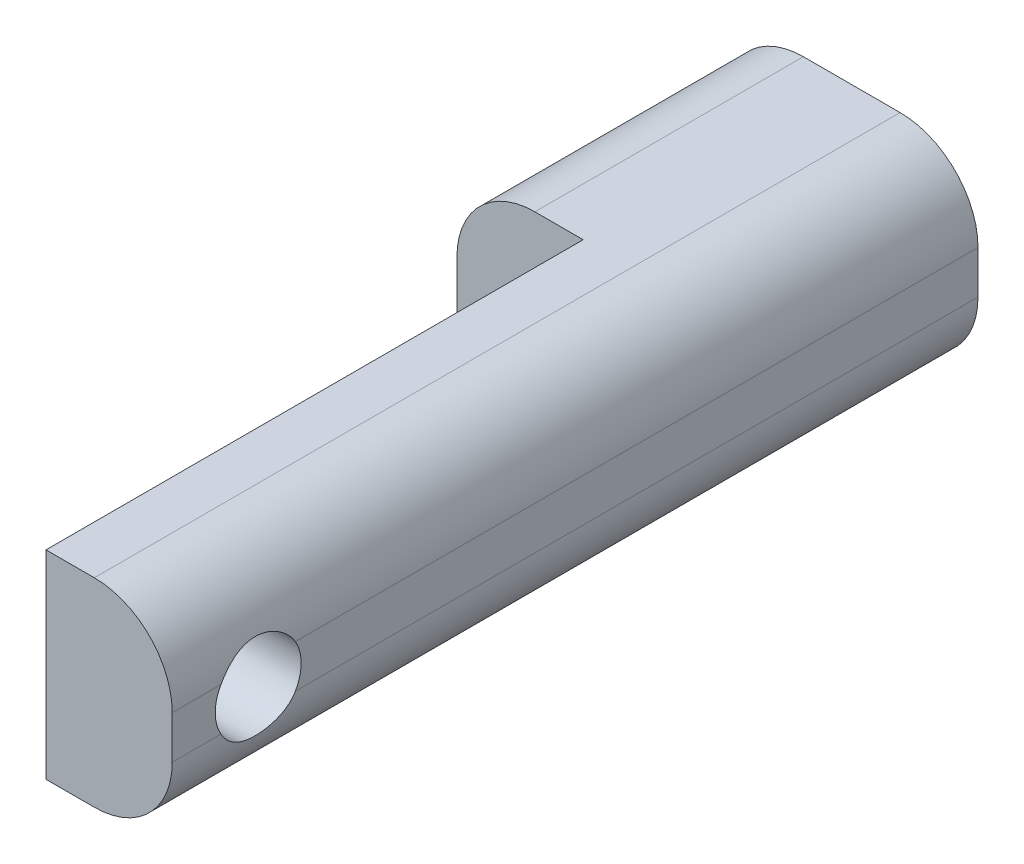
ISO-10303-21;
HEADER;
FILE_DESCRIPTION(('STEP AP214'),'2;1');
FILE_NAME('part.step','',(''),(''),'','','');
FILE_SCHEMA(('AUTOMOTIVE_DESIGN { 1 0 10303 214 1 1 1 1 }'));
ENDSEC;
DATA;
#1=APPLICATION_CONTEXT('core data for automotive mechanical design processes');
#2=APPLICATION_PROTOCOL_DEFINITION('international standard','automotive_design',2000,#1);
#3=PRODUCT_CONTEXT('',#1,'mechanical');
#4=PRODUCT('Part','Part','',(#3));
#5=PRODUCT_RELATED_PRODUCT_CATEGORY('part','',(#4));
#6=PRODUCT_DEFINITION_FORMATION('','',#4);
#7=PRODUCT_DEFINITION_CONTEXT('part definition',#1,'design');
#8=PRODUCT_DEFINITION('design','',#6,#7);
#9=PRODUCT_DEFINITION_SHAPE('','',#8);
#10=(LENGTH_UNIT() NAMED_UNIT(*) SI_UNIT(.MILLI.,.METRE.));
#11=(NAMED_UNIT(*) PLANE_ANGLE_UNIT() SI_UNIT($,.RADIAN.));
#12=(NAMED_UNIT(*) SI_UNIT($,.STERADIAN.) SOLID_ANGLE_UNIT());
#13=UNCERTAINTY_MEASURE_WITH_UNIT(LENGTH_MEASURE(1.E-05),#10,'distance_accuracy_value','');
#14=(GEOMETRIC_REPRESENTATION_CONTEXT(3) GLOBAL_UNCERTAINTY_ASSIGNED_CONTEXT((#13)) GLOBAL_UNIT_ASSIGNED_CONTEXT((#10,
#11,#12)) REPRESENTATION_CONTEXT('',''));
#15=CARTESIAN_POINT('',(0.,0.,0.));
#16=DIRECTION('',(0.,0.,1.));
#17=DIRECTION('',(1.,0.,0.));
#18=AXIS2_PLACEMENT_3D('',#15,#16,#17);
#19=CARTESIAN_POINT('',(4.7,-0.8,41.86));
#20=DIRECTION('',(-1.,0.,0.));
#21=DIRECTION('',(0.,-1.,0.));
#22=AXIS2_PLACEMENT_3D('',#19,#20,#21);
#23=PLANE('',#22);
#24=DIRECTION('',(0.,0.,-1.));
#25=VECTOR('',#24,1.);
#26=CARTESIAN_POINT('',(4.7,-0.8,41.86));
#27=LINE('',#26,#25);
#28=CARTESIAN_POINT('',(4.7,-0.8,41.86));
#29=VERTEX_POINT('',#28);
#30=CARTESIAN_POINT('',(4.7,-0.8,40.0456406460551));
#31=VERTEX_POINT('',#30);
#32=EDGE_CURVE('E144',#29,#31,#27,.T.);
#33=ORIENTED_EDGE('',*,*,#32,.T.);
#34=CARTESIAN_POINT('',(4.7,0.,38.66));
#35=DIRECTION('',(-1.,0.,0.));
#36=DIRECTION('',(0.,-1.,0.));
#37=AXIS2_PLACEMENT_3D('',#34,#35,#36);
#38=CIRCLE('',#37,1.6);
#39=CARTESIAN_POINT('',(4.7,0.8,40.0456406460551));
#40=VERTEX_POINT('',#39);
#41=EDGE_CURVE('E132',#31,#40,#38,.T.);
#42=ORIENTED_EDGE('',*,*,#41,.T.);
#43=DIRECTION('',(0.,0.,-1.));
#44=VECTOR('',#43,1.);
#45=CARTESIAN_POINT('',(4.7,0.8,41.86));
#46=LINE('',#45,#44);
#47=CARTESIAN_POINT('',(4.7,0.8,41.86));
#48=VERTEX_POINT('',#47);
#49=EDGE_CURVE('E142',#48,#40,#46,.T.);
#50=ORIENTED_EDGE('',*,*,#49,.F.);
#51=DIRECTION('',(0.,1.,0.));
#52=VECTOR('',#51,1.);
#53=CARTESIAN_POINT('',(4.7,-0.8,41.86));
#54=LINE('',#53,#52);
#55=EDGE_CURVE('E213',#29,#48,#54,.T.);
#56=ORIENTED_EDGE('',*,*,#55,.F.);
#57=EDGE_LOOP('',(#33,#42,#50,#56));
#58=FACE_BOUND('',#57,.T.);
#59=ADVANCED_FACE('F43',(#58),#23,.F.);
#60=CARTESIAN_POINT('',(-4.7,0.8,41.86));
#61=DIRECTION('',(1.,0.,0.));
#62=DIRECTION('',(0.,0.,-1.));
#63=AXIS2_PLACEMENT_3D('',#60,#61,#62);
#64=PLANE('',#63);
#65=DIRECTION('',(0.,-1.,0.));
#66=VECTOR('',#65,1.);
#67=CARTESIAN_POINT('',(-4.7,0.,21.86));
#68=LINE('',#67,#66);
#69=CARTESIAN_POINT('',(-4.7,0.8,21.86));
#70=VERTEX_POINT('',#69);
#71=CARTESIAN_POINT('',(-4.7,-0.8,21.86));
#72=VERTEX_POINT('',#71);
#73=EDGE_CURVE('E292',#70,#72,#68,.T.);
#74=ORIENTED_EDGE('',*,*,#73,.F.);
#75=DIRECTION('',(0.,0.,-1.));
#76=VECTOR('',#75,1.);
#77=CARTESIAN_POINT('',(-4.7,0.8,41.86));
#78=LINE('',#77,#76);
#79=CARTESIAN_POINT('',(-4.7,0.8,11.86));
#80=VERTEX_POINT('',#79);
#81=EDGE_CURVE('E11',#70,#80,#78,.T.);
#82=ORIENTED_EDGE('',*,*,#81,.T.);
#83=DIRECTION('',(0.,-1.,0.));
#84=VECTOR('',#83,1.);
#85=CARTESIAN_POINT('',(-4.7,0.8,11.86));
#86=LINE('',#85,#84);
#87=CARTESIAN_POINT('',(-4.7,-0.8,11.86));
#88=VERTEX_POINT('',#87);
#89=EDGE_CURVE('E180',#80,#88,#86,.T.);
#90=ORIENTED_EDGE('',*,*,#89,.T.);
#91=DIRECTION('',(0.,0.,-1.));
#92=VECTOR('',#91,1.);
#93=CARTESIAN_POINT('',(-4.7,-0.8,41.86));
#94=LINE('',#93,#92);
#95=EDGE_CURVE('E51',#72,#88,#94,.T.);
#96=ORIENTED_EDGE('',*,*,#95,.F.);
#97=EDGE_LOOP('',(#74,#82,#90,#96));
#98=FACE_BOUND('',#97,.T.);
#99=ADVANCED_FACE('F177',(#98),#64,.F.);
#100=CARTESIAN_POINT('',(-1.8,-3.7,41.86));
#101=DIRECTION('',(0.,1.,0.));
#102=DIRECTION('',(0.,0.,1.));
#103=AXIS2_PLACEMENT_3D('',#100,#101,#102);
#104=PLANE('',#103);
#105=DIRECTION('',(1.,0.,0.));
#106=VECTOR('',#105,1.);
#107=CARTESIAN_POINT('',(0.,-3.7,21.86));
#108=LINE('',#107,#106);
#109=CARTESIAN_POINT('',(-1.8,-3.7,21.86));
#110=VERTEX_POINT('',#109);
#111=CARTESIAN_POINT('',(0.,-3.7,21.86));
#112=VERTEX_POINT('',#111);
#113=EDGE_CURVE('E218',#110,#112,#108,.T.);
#114=ORIENTED_EDGE('',*,*,#113,.F.);
#115=DIRECTION('',(0.,0.,-1.));
#116=VECTOR('',#115,1.);
#117=CARTESIAN_POINT('',(-1.8,-3.7,41.86));
#118=LINE('',#117,#116);
#119=CARTESIAN_POINT('',(-1.8,-3.7,11.86));
#120=VERTEX_POINT('',#119);
#121=EDGE_CURVE('E165',#110,#120,#118,.T.);
#122=ORIENTED_EDGE('',*,*,#121,.T.);
#123=DIRECTION('',(1.,0.,0.));
#124=VECTOR('',#123,1.);
#125=CARTESIAN_POINT('',(-1.8,-3.7,11.86));
#126=LINE('',#125,#124);
#127=CARTESIAN_POINT('',(1.8,-3.7,11.86));
#128=VERTEX_POINT('',#127);
#129=EDGE_CURVE('E190',#120,#128,#126,.T.);
#130=ORIENTED_EDGE('',*,*,#129,.T.);
#131=DIRECTION('',(0.,0.,-1.));
#132=VECTOR('',#131,1.);
#133=CARTESIAN_POINT('',(1.8,-3.7,41.86));
#134=LINE('',#133,#132);
#135=CARTESIAN_POINT('',(1.8,-3.7,41.86));
#136=VERTEX_POINT('',#135);
#137=EDGE_CURVE('E157',#136,#128,#134,.T.);
#138=ORIENTED_EDGE('',*,*,#137,.F.);
#139=DIRECTION('',(1.,0.,0.));
#140=VECTOR('',#139,1.);
#141=CARTESIAN_POINT('',(-1.8,-3.7,41.86));
#142=LINE('',#141,#140);
#143=CARTESIAN_POINT('',(0.,-3.7,41.86));
#144=VERTEX_POINT('',#143);
#145=EDGE_CURVE('E205',#144,#136,#142,.T.);
#146=ORIENTED_EDGE('',*,*,#145,.F.);
#147=DIRECTION('',(0.,0.,1.));
#148=VECTOR('',#147,1.);
#149=CARTESIAN_POINT('',(0.,-3.7,21.86));
#150=LINE('',#149,#148);
#151=EDGE_CURVE('E66',#112,#144,#150,.T.);
#152=ORIENTED_EDGE('',*,*,#151,.F.);
#153=EDGE_LOOP('',(#114,#122,#130,#138,#146,#152));
#154=FACE_BOUND('',#153,.T.);
#155=ADVANCED_FACE('F274',(#154),#104,.F.);
#156=CARTESIAN_POINT('',(-1.8,0.8,41.86));
#157=DIRECTION('',(0.,0.,1.));
#158=DIRECTION('',(1.,0.,0.));
#159=AXIS2_PLACEMENT_3D('',#156,#157,#158);
#160=PLANE('',#159);
#161=DIRECTION('',(-1.,0.,0.));
#162=VECTOR('',#161,1.);
#163=CARTESIAN_POINT('',(1.8,3.7,41.86));
#164=LINE('',#163,#162);
#165=CARTESIAN_POINT('',(1.8,3.7,41.86));
#166=VERTEX_POINT('',#165);
#167=CARTESIAN_POINT('',(0.,3.7,41.86));
#168=VERTEX_POINT('',#167);
#169=EDGE_CURVE('E204',#166,#168,#164,.T.);
#170=ORIENTED_EDGE('',*,*,#169,.T.);
#171=DIRECTION('',(0.,-1.,0.));
#172=VECTOR('',#171,1.);
#173=CARTESIAN_POINT('',(0.,0.,41.86));
#174=LINE('',#173,#172);
#175=EDGE_CURVE('E225',#168,#144,#174,.T.);
#176=ORIENTED_EDGE('',*,*,#175,.T.);
#177=ORIENTED_EDGE('',*,*,#145,.T.);
#178=CARTESIAN_POINT('',(1.8,-0.8,41.86));
#179=DIRECTION('',(0.,0.,1.));
#180=DIRECTION('',(1.,0.,0.));
#181=AXIS2_PLACEMENT_3D('',#178,#179,#180);
#182=CIRCLE('',#181,2.9);
#183=EDGE_CURVE('E227',#136,#29,#182,.T.);
#184=ORIENTED_EDGE('',*,*,#183,.T.);
#185=ORIENTED_EDGE('',*,*,#55,.T.);
#186=CARTESIAN_POINT('',(1.8,0.8,41.86));
#187=DIRECTION('',(0.,0.,1.));
#188=DIRECTION('',(1.,0.,0.));
#189=AXIS2_PLACEMENT_3D('',#186,#187,#188);
#190=CIRCLE('',#189,2.9);
#191=EDGE_CURVE('E147',#48,#166,#190,.T.);
#192=ORIENTED_EDGE('',*,*,#191,.T.);
#193=EDGE_LOOP('',(#170,#176,#177,#184,#185,#192));
#194=FACE_BOUND('',#193,.T.);
#195=ADVANCED_FACE('F230',(#194),#160,.T.);
#196=CARTESIAN_POINT('',(-1.8,0.8,41.86));
#197=DIRECTION('',(0.,0.,-1.));
#198=DIRECTION('',(-1.,0.,0.));
#199=AXIS2_PLACEMENT_3D('',#196,#197,#198);
#200=CYLINDRICAL_SURFACE('',#199,2.9);
#201=CARTESIAN_POINT('',(-1.8,0.8,21.86));
#202=DIRECTION('',(0.,0.,1.));
#203=DIRECTION('',(1.,0.,0.));
#204=AXIS2_PLACEMENT_3D('',#201,#202,#203);
#205=CIRCLE('',#204,2.9);
#206=CARTESIAN_POINT('',(-1.8,3.7,21.86));
#207=VERTEX_POINT('',#206);
#208=EDGE_CURVE('E288',#207,#70,#205,.T.);
#209=ORIENTED_EDGE('',*,*,#208,.F.);
#210=DIRECTION('',(0.,0.,-1.));
#211=VECTOR('',#210,1.);
#212=CARTESIAN_POINT('',(-1.8,3.7,41.86));
#213=LINE('',#212,#211);
#214=CARTESIAN_POINT('',(-1.8,3.7,11.86));
#215=VERTEX_POINT('',#214);
#216=EDGE_CURVE('E201',#207,#215,#213,.T.);
#217=ORIENTED_EDGE('',*,*,#216,.T.);
#218=CARTESIAN_POINT('',(-1.8,0.8,11.86));
#219=DIRECTION('',(0.,0.,1.));
#220=DIRECTION('',(1.,0.,0.));
#221=AXIS2_PLACEMENT_3D('',#218,#219,#220);
#222=CIRCLE('',#221,2.9);
#223=EDGE_CURVE('E181',#215,#80,#222,.T.);
#224=ORIENTED_EDGE('',*,*,#223,.T.);
#225=ORIENTED_EDGE('',*,*,#81,.F.);
#226=EDGE_LOOP('',(#209,#217,#224,#225));
#227=FACE_BOUND('',#226,.T.);
#228=ADVANCED_FACE('F44',(#227),#200,.T.);
#229=CARTESIAN_POINT('',(-1.8,-0.8,41.86));
#230=DIRECTION('',(0.,0.,-1.));
#231=DIRECTION('',(-1.,0.,0.));
#232=AXIS2_PLACEMENT_3D('',#229,#230,#231);
#233=CYLINDRICAL_SURFACE('',#232,2.9);
#234=CARTESIAN_POINT('',(-1.8,-0.8,21.86));
#235=DIRECTION('',(0.,0.,1.));
#236=DIRECTION('',(1.,0.,0.));
#237=AXIS2_PLACEMENT_3D('',#234,#235,#236);
#238=CIRCLE('',#237,2.9);
#239=EDGE_CURVE('E174',#72,#110,#238,.T.);
#240=ORIENTED_EDGE('',*,*,#239,.F.);
#241=ORIENTED_EDGE('',*,*,#95,.T.);
#242=CARTESIAN_POINT('',(-1.8,-0.8,11.86));
#243=DIRECTION('',(0.,0.,1.));
#244=DIRECTION('',(1.,0.,0.));
#245=AXIS2_PLACEMENT_3D('',#242,#243,#244);
#246=CIRCLE('',#245,2.9);
#247=EDGE_CURVE('E172',#88,#120,#246,.T.);
#248=ORIENTED_EDGE('',*,*,#247,.T.);
#249=ORIENTED_EDGE('',*,*,#121,.F.);
#250=EDGE_LOOP('',(#240,#241,#248,#249));
#251=FACE_BOUND('',#250,.T.);
#252=ADVANCED_FACE('F169',(#251),#233,.T.);
#253=CARTESIAN_POINT('',(1.8,-0.8,41.86));
#254=DIRECTION('',(0.,0.,-1.));
#255=DIRECTION('',(-1.,0.,0.));
#256=AXIS2_PLACEMENT_3D('',#253,#254,#255);
#257=CYLINDRICAL_SURFACE('',#256,2.9);
#258=CARTESIAN_POINT('',(4.7,-0.8,37.2743593539449));
#259=VERTEX_POINT('',#258);
#260=CARTESIAN_POINT('',(4.7,-0.8,11.86));
#261=VERTEX_POINT('',#260);
#262=EDGE_CURVE('E151',#259,#261,#27,.T.);
#263=ORIENTED_EDGE('',*,*,#262,.F.);
#264=CARTESIAN_POINT('',(4.7,-0.8,37.2743593539449));
#265=CARTESIAN_POINT('',(4.70000235481667,-0.83838903720111,37.2965216914201));
#266=CARTESIAN_POINT('',(4.69923743644414,-0.875830126594817,37.3202680267735));
#267=CARTESIAN_POINT('',(4.69642005902891,-0.948567287027352,37.3707447010587));
#268=CARTESIAN_POINT('',(4.69436821863104,-0.983864379783748,37.3974736011495));
#269=CARTESIAN_POINT('',(4.68666608232362,-1.08602288359622,37.4817298205142));
#270=CARTESIAN_POINT('',(4.6794663147946,-1.14937632281906,37.5434569623675));
#271=CARTESIAN_POINT('',(4.6630951913247,-1.26486400863791,37.6761993516635));
#272=CARTESIAN_POINT('',(4.65392615247991,-1.31701129764774,37.7472036452385));
#273=CARTESIAN_POINT('',(4.63572055059744,-1.40900841650061,37.8968439344227));
#274=CARTESIAN_POINT('',(4.62668404178945,-1.44885333911133,37.9754829590156));
#275=CARTESIAN_POINT('',(4.61041759187101,-1.51609599061913,38.1407390139905));
#276=CARTESIAN_POINT('',(4.60324600262803,-1.54310962387564,38.2275188236113));
#277=CARTESIAN_POINT('',(4.59262638940859,-1.58208287762768,38.4046063093228));
#278=CARTESIAN_POINT('',(4.58917709802413,-1.59404762236037,38.4949127737611));
#279=CARTESIAN_POINT('',(4.58679549396835,-1.60236389882104,38.6735589324986));
#280=CARTESIAN_POINT('',(4.58772980978937,-1.59917639889648,38.7618755753879));
#281=CARTESIAN_POINT('',(4.59361280032031,-1.57835796484516,38.9366417521026));
#282=CARTESIAN_POINT('',(4.59856135013732,-1.56072748007577,39.0230913439309));
#283=CARTESIAN_POINT('',(4.61136971499201,-1.51191426709748,39.1907059827608));
#284=CARTESIAN_POINT('',(4.61919435101859,-1.48089454240634,39.2719214967966));
#285=CARTESIAN_POINT('',(4.63619445918464,-1.40618641918205,39.4282102088998));
#286=CARTESIAN_POINT('',(4.64537091657274,-1.36248875787053,39.5032788643334));
#287=CARTESIAN_POINT('',(4.66350265017557,-1.26160414607534,39.648154441537));
#288=CARTESIAN_POINT('',(4.67243582899265,-1.20396284584633,39.7176477526859));
#289=CARTESIAN_POINT('',(4.68736927672622,-1.07768608269737,39.8460274235241));
#290=CARTESIAN_POINT('',(4.69337590517706,-1.00907489302541,39.904936605463));
#291=CARTESIAN_POINT('',(4.69783813363381,-0.914102188880655,39.9734504792746));
#292=CARTESIAN_POINT('',(4.6986361715091,-0.891787522111184,39.9887014974285));
#293=CARTESIAN_POINT('',(4.69971664845041,-0.846431801018911,40.0180425527052));
#294=CARTESIAN_POINT('',(4.69999967546601,-0.823391605599749,40.0321338961655));
#295=CARTESIAN_POINT('',(4.70000000000002,-0.800000000000007,40.0456406460551));
#296=B_SPLINE_CURVE_WITH_KNOTS('',3,(#264,#265,#266,#267,#268,#269,#270,#271,#272,#273,#274,
#275,#276,#277,#278,#279,#280,#281,#282,#283,#284,#285,#286,#287,#288,#289,#290,#291,#292,#293,
#294,#295),.UNSPECIFIED.,.F.,.F.,(4,2,2,2,2,2,2,2,2,2,2,2,2,2,2,4),(0.,0.132883354979596,
0.265702879627799,0.530572893574513,0.795132945415002,1.05979839042499,1.33195258325669,
1.60401408083667,1.86785271361435,2.13168313802432,2.39238842370651,2.65328466813409,
2.9242198259425,3.19456357321334,3.27565595873158,3.35665570888573),.UNSPECIFIED.);
#297=EDGE_CURVE('E148',#259,#31,#296,.T.);
#298=ORIENTED_EDGE('',*,*,#297,.T.);
#299=ORIENTED_EDGE('',*,*,#32,.F.);
#300=ORIENTED_EDGE('',*,*,#183,.F.);
#301=ORIENTED_EDGE('',*,*,#137,.T.);
#302=CARTESIAN_POINT('',(1.8,-0.8,11.86));
#303=DIRECTION('',(0.,0.,1.));
#304=DIRECTION('',(1.,0.,0.));
#305=AXIS2_PLACEMENT_3D('',#302,#303,#304);
#306=CIRCLE('',#305,2.9);
#307=EDGE_CURVE('E186',#128,#261,#306,.T.);
#308=ORIENTED_EDGE('',*,*,#307,.T.);
#309=EDGE_LOOP('',(#263,#298,#299,#300,#301,#308));
#310=FACE_BOUND('',#309,.T.);
#311=ADVANCED_FACE('F232',(#310),#257,.T.);
#312=CARTESIAN_POINT('',(4.7,0.8,37.2743593539449));
#313=VERTEX_POINT('',#312);
#314=CARTESIAN_POINT('',(4.7,0.8,11.86));
#315=VERTEX_POINT('',#314);
#316=EDGE_CURVE('E155',#313,#315,#46,.T.);
#317=ORIENTED_EDGE('',*,*,#316,.F.);
#318=EDGE_CURVE('E59',#313,#259,#38,.T.);
#319=ORIENTED_EDGE('',*,*,#318,.T.);
#320=ORIENTED_EDGE('',*,*,#262,.T.);
#321=DIRECTION('',(0.,1.,0.));
#322=VECTOR('',#321,1.);
#323=CARTESIAN_POINT('',(4.7,-0.8,11.86));
#324=LINE('',#323,#322);
#325=EDGE_CURVE('E194',#261,#315,#324,.T.);
#326=ORIENTED_EDGE('',*,*,#325,.T.);
#327=EDGE_LOOP('',(#317,#319,#320,#326));
#328=FACE_BOUND('',#327,.T.);
#329=ADVANCED_FACE('F262',(#328),#23,.F.);
#330=CARTESIAN_POINT('',(1.8,0.8,41.86));
#331=DIRECTION('',(0.,0.,-1.));
#332=DIRECTION('',(-1.,0.,0.));
#333=AXIS2_PLACEMENT_3D('',#330,#331,#332);
#334=CYLINDRICAL_SURFACE('',#333,2.9);
#335=ORIENTED_EDGE('',*,*,#49,.T.);
#336=CARTESIAN_POINT('',(4.7,0.8,40.0456406460551));
#337=CARTESIAN_POINT('',(4.70000235481667,0.83838903720111,40.0234783085799));
#338=CARTESIAN_POINT('',(4.69923743644414,0.875830126594817,39.9997319732265));
#339=CARTESIAN_POINT('',(4.69642005902891,0.948567287027351,39.9492552989413));
#340=CARTESIAN_POINT('',(4.69436821863104,0.983864379783748,39.9225263988505));
#341=CARTESIAN_POINT('',(4.68666608232361,1.08602288359622,39.8382701794858));
#342=CARTESIAN_POINT('',(4.6794663147946,1.14937632281906,39.7765430376325));
#343=CARTESIAN_POINT('',(4.6630951913247,1.26486400863791,39.6438006483365));
#344=CARTESIAN_POINT('',(4.65392615247991,1.31701129764774,39.5727963547615));
#345=CARTESIAN_POINT('',(4.63572055059744,1.40900841650061,39.4231560655773));
#346=CARTESIAN_POINT('',(4.62668404178945,1.44885333911133,39.3445170409844));
#347=CARTESIAN_POINT('',(4.61041759187101,1.51609599061913,39.1792609860095));
#348=CARTESIAN_POINT('',(4.60324600262803,1.54310962387564,39.0924811763887));
#349=CARTESIAN_POINT('',(4.59262638940859,1.58208287762768,38.9153936906772));
#350=CARTESIAN_POINT('',(4.58917709802413,1.59404762236037,38.8250872262389));
#351=CARTESIAN_POINT('',(4.58679549396835,1.60236389882104,38.6464410675014));
#352=CARTESIAN_POINT('',(4.58772980978937,1.59917639889648,38.5581244246121));
#353=CARTESIAN_POINT('',(4.59361280032031,1.57835796484516,38.3833582478974));
#354=CARTESIAN_POINT('',(4.59856135013732,1.56072748007577,38.2969086560691));
#355=CARTESIAN_POINT('',(4.61136971499201,1.51191426709748,38.1292940172392));
#356=CARTESIAN_POINT('',(4.61919435101859,1.48089454240634,38.0480785032034));
#357=CARTESIAN_POINT('',(4.63619445918464,1.40618641918205,37.8917897911002));
#358=CARTESIAN_POINT('',(4.64537091657274,1.36248875787052,37.8167211356666));
#359=CARTESIAN_POINT('',(4.66350265017557,1.26160414607534,37.671845558463));
#360=CARTESIAN_POINT('',(4.67243582899265,1.20396284584633,37.6023522473141));
#361=CARTESIAN_POINT('',(4.68736927672622,1.07768608269737,37.4739725764759));
#362=CARTESIAN_POINT('',(4.69337590517706,1.00907489302541,37.415063394537));
#363=CARTESIAN_POINT('',(4.69783813363381,0.914102188880656,37.3465495207254));
#364=CARTESIAN_POINT('',(4.6986361715091,0.891787522111185,37.3312985025715));
#365=CARTESIAN_POINT('',(4.69971664845041,0.846431801018912,37.3019574472948));
#366=CARTESIAN_POINT('',(4.69999967546601,0.823391605599749,37.2878661038345));
#367=CARTESIAN_POINT('',(4.70000000000002,0.800000000000006,37.2743593539449));
#368=B_SPLINE_CURVE_WITH_KNOTS('',3,(#336,#337,#338,#339,#340,#341,#342,#343,#344,#345,#346,
#347,#348,#349,#350,#351,#352,#353,#354,#355,#356,#357,#358,#359,#360,#361,#362,#363,#364,#365,
#366,#367),.UNSPECIFIED.,.F.,.F.,(4,2,2,2,2,2,2,2,2,2,2,2,2,2,2,4),(0.,0.132883354979596,
0.265702879627798,0.530572893574512,0.795132945415002,1.05979839042499,1.33195258325669,
1.60401408083667,1.86785271361435,2.13168313802432,2.39238842370651,2.65328466813409,
2.9242198259425,3.19456357321334,3.27565595873157,3.35665570888573),.UNSPECIFIED.);
#369=EDGE_CURVE('E126',#40,#313,#368,.T.);
#370=ORIENTED_EDGE('',*,*,#369,.T.);
#371=ORIENTED_EDGE('',*,*,#316,.T.);
#372=CARTESIAN_POINT('',(1.8,0.8,11.86));
#373=DIRECTION('',(0.,0.,1.));
#374=DIRECTION('',(1.,0.,0.));
#375=AXIS2_PLACEMENT_3D('',#372,#373,#374);
#376=CIRCLE('',#375,2.9);
#377=CARTESIAN_POINT('',(1.8,3.7,11.86));
#378=VERTEX_POINT('',#377);
#379=EDGE_CURVE('E196',#315,#378,#376,.T.);
#380=ORIENTED_EDGE('',*,*,#379,.T.);
#381=DIRECTION('',(0.,0.,-1.));
#382=VECTOR('',#381,1.);
#383=CARTESIAN_POINT('',(1.8,3.7,41.86));
#384=LINE('',#383,#382);
#385=EDGE_CURVE('E154',#166,#378,#384,.T.);
#386=ORIENTED_EDGE('',*,*,#385,.F.);
#387=ORIENTED_EDGE('',*,*,#191,.F.);
#388=EDGE_LOOP('',(#335,#370,#371,#380,#386,#387));
#389=FACE_BOUND('',#388,.T.);
#390=ADVANCED_FACE('F146',(#389),#334,.T.);
#391=CARTESIAN_POINT('',(1.8,3.7,41.86));
#392=DIRECTION('',(0.,-1.,0.));
#393=DIRECTION('',(0.,0.,-1.));
#394=AXIS2_PLACEMENT_3D('',#391,#392,#393);
#395=PLANE('',#394);
#396=DIRECTION('',(-1.,0.,0.));
#397=VECTOR('',#396,1.);
#398=CARTESIAN_POINT('',(0.,3.7,21.86));
#399=LINE('',#398,#397);
#400=CARTESIAN_POINT('',(0.,3.7,21.86));
#401=VERTEX_POINT('',#400);
#402=EDGE_CURVE('E295',#401,#207,#399,.T.);
#403=ORIENTED_EDGE('',*,*,#402,.F.);
#404=DIRECTION('',(0.,0.,1.));
#405=VECTOR('',#404,1.);
#406=CARTESIAN_POINT('',(0.,3.7,21.86));
#407=LINE('',#406,#405);
#408=EDGE_CURVE('E216',#401,#168,#407,.T.);
#409=ORIENTED_EDGE('',*,*,#408,.T.);
#410=ORIENTED_EDGE('',*,*,#169,.F.);
#411=ORIENTED_EDGE('',*,*,#385,.T.);
#412=DIRECTION('',(-1.,0.,0.));
#413=VECTOR('',#412,1.);
#414=CARTESIAN_POINT('',(1.8,3.7,11.86));
#415=LINE('',#414,#413);
#416=EDGE_CURVE('E199',#378,#215,#415,.T.);
#417=ORIENTED_EDGE('',*,*,#416,.T.);
#418=ORIENTED_EDGE('',*,*,#216,.F.);
#419=EDGE_LOOP('',(#403,#409,#410,#411,#417,#418));
#420=FACE_BOUND('',#419,.T.);
#421=ADVANCED_FACE('F263',(#420),#395,.F.);
#422=CARTESIAN_POINT('',(-1.8,0.8,11.86));
#423=DIRECTION('',(0.,0.,1.));
#424=DIRECTION('',(1.,0.,0.));
#425=AXIS2_PLACEMENT_3D('',#422,#423,#424);
#426=PLANE('',#425);
#427=ORIENTED_EDGE('',*,*,#223,.F.);
#428=ORIENTED_EDGE('',*,*,#416,.F.);
#429=ORIENTED_EDGE('',*,*,#379,.F.);
#430=ORIENTED_EDGE('',*,*,#325,.F.);
#431=ORIENTED_EDGE('',*,*,#307,.F.);
#432=ORIENTED_EDGE('',*,*,#129,.F.);
#433=ORIENTED_EDGE('',*,*,#247,.F.);
#434=ORIENTED_EDGE('',*,*,#89,.F.);
#435=EDGE_LOOP('',(#427,#428,#429,#430,#431,#432,#433,#434));
#436=FACE_BOUND('',#435,.T.);
#437=ADVANCED_FACE('F183',(#436),#426,.F.);
#438=CARTESIAN_POINT('',(0.,0.,21.86));
#439=DIRECTION('',(-1.,0.,0.));
#440=DIRECTION('',(0.,-1.,0.));
#441=AXIS2_PLACEMENT_3D('',#438,#439,#440);
#442=PLANE('',#441);
#443=CARTESIAN_POINT('',(0.,0.,38.66));
#444=DIRECTION('',(-1.,0.,0.));
#445=DIRECTION('',(0.,-1.,0.));
#446=AXIS2_PLACEMENT_3D('',#443,#444,#445);
#447=CIRCLE('',#446,1.6);
#448=CARTESIAN_POINT('',(0.,-1.6,38.66));
#449=VERTEX_POINT('',#448);
#450=EDGE_CURVE('E136',#449,#449,#447,.T.);
#451=ORIENTED_EDGE('',*,*,#450,.F.);
#452=EDGE_LOOP('',(#451));
#453=FACE_BOUND('',#452,.T.);
#454=ORIENTED_EDGE('',*,*,#175,.F.);
#455=ORIENTED_EDGE('',*,*,#408,.F.);
#456=DIRECTION('',(0.,-1.,0.));
#457=VECTOR('',#456,1.);
#458=CARTESIAN_POINT('',(0.,0.,21.86));
#459=LINE('',#458,#457);
#460=EDGE_CURVE('E234',#401,#112,#459,.T.);
#461=ORIENTED_EDGE('',*,*,#460,.T.);
#462=ORIENTED_EDGE('',*,*,#151,.T.);
#463=EDGE_LOOP('',(#454,#455,#461,#462));
#464=FACE_BOUND('',#463,.T.);
#465=ADVANCED_FACE('F303',(#453,#464),#442,.T.);
#466=CARTESIAN_POINT('',(0.,0.,21.86));
#467=DIRECTION('',(0.,0.,1.));
#468=DIRECTION('',(1.,0.,0.));
#469=AXIS2_PLACEMENT_3D('',#466,#467,#468);
#470=PLANE('',#469);
#471=ORIENTED_EDGE('',*,*,#460,.F.);
#472=ORIENTED_EDGE('',*,*,#402,.T.);
#473=ORIENTED_EDGE('',*,*,#208,.T.);
#474=ORIENTED_EDGE('',*,*,#73,.T.);
#475=ORIENTED_EDGE('',*,*,#239,.T.);
#476=ORIENTED_EDGE('',*,*,#113,.T.);
#477=EDGE_LOOP('',(#471,#472,#473,#474,#475,#476));
#478=FACE_BOUND('',#477,.T.);
#479=ADVANCED_FACE('F249',(#478),#470,.T.);
#480=CARTESIAN_POINT('',(7.,0.,38.66));
#481=DIRECTION('',(-1.,0.,0.));
#482=DIRECTION('',(0.,-1.,0.));
#483=AXIS2_PLACEMENT_3D('',#480,#481,#482);
#484=CYLINDRICAL_SURFACE('',#483,1.6);
#485=ORIENTED_EDGE('',*,*,#450,.T.);
#486=EDGE_LOOP('',(#485));
#487=FACE_BOUND('',#486,.T.);
#488=ORIENTED_EDGE('',*,*,#318,.F.);
#489=ORIENTED_EDGE('',*,*,#369,.F.);
#490=ORIENTED_EDGE('',*,*,#41,.F.);
#491=ORIENTED_EDGE('',*,*,#297,.F.);
#492=EDGE_LOOP('',(#488,#489,#490,#491));
#493=FACE_BOUND('',#492,.T.);
#494=ADVANCED_FACE('F128',(#487,#493),#484,.F.);
#495=CLOSED_SHELL('',(#59,#99,#155,#195,#228,#252,#311,#329,#390,#421,#437,#465,#479,#494));
#496=MANIFOLD_SOLID_BREP('B2',#495);
#497=ADVANCED_BREP_SHAPE_REPRESENTATION('',(#18,#496),#14);
#498=SHAPE_DEFINITION_REPRESENTATION(#9,#497);
ENDSEC;
END-ISO-10303-21;
